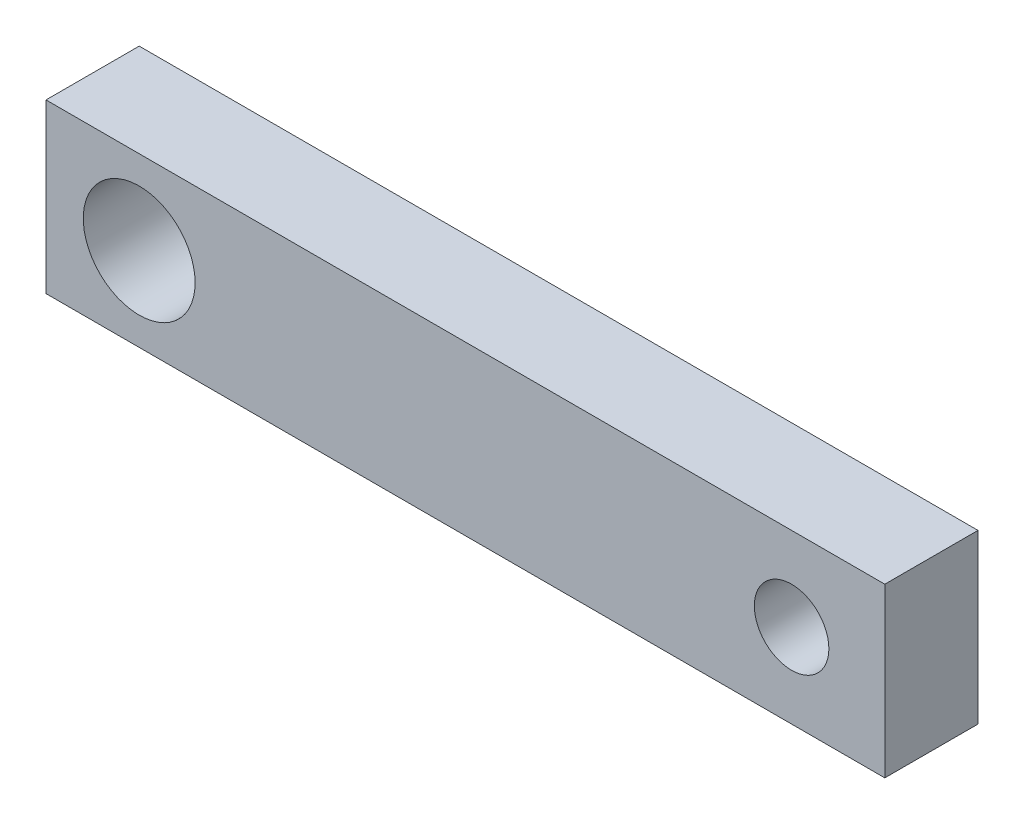
ISO-10303-21;
HEADER;
FILE_DESCRIPTION(('STEP AP214'),'2;1');
FILE_NAME('part.step','',(''),(''),'','','');
FILE_SCHEMA(('AUTOMOTIVE_DESIGN { 1 0 10303 214 1 1 1 1 }'));
ENDSEC;
DATA;
#1=APPLICATION_CONTEXT('core data for automotive mechanical design processes');
#2=APPLICATION_PROTOCOL_DEFINITION('international standard','automotive_design',2000,#1);
#3=PRODUCT_CONTEXT('',#1,'mechanical');
#4=PRODUCT('Part','Part','',(#3));
#5=PRODUCT_RELATED_PRODUCT_CATEGORY('part','',(#4));
#6=PRODUCT_DEFINITION_FORMATION('','',#4);
#7=PRODUCT_DEFINITION_CONTEXT('part definition',#1,'design');
#8=PRODUCT_DEFINITION('design','',#6,#7);
#9=PRODUCT_DEFINITION_SHAPE('','',#8);
#10=(LENGTH_UNIT() NAMED_UNIT(*) SI_UNIT(.MILLI.,.METRE.));
#11=(NAMED_UNIT(*) PLANE_ANGLE_UNIT() SI_UNIT($,.RADIAN.));
#12=(NAMED_UNIT(*) SI_UNIT($,.STERADIAN.) SOLID_ANGLE_UNIT());
#13=UNCERTAINTY_MEASURE_WITH_UNIT(LENGTH_MEASURE(1.E-05),#10,'distance_accuracy_value','');
#14=(GEOMETRIC_REPRESENTATION_CONTEXT(3) GLOBAL_UNCERTAINTY_ASSIGNED_CONTEXT((#13)) GLOBAL_UNIT_ASSIGNED_CONTEXT((#10,
#11,#12)) REPRESENTATION_CONTEXT('',''));
#15=CARTESIAN_POINT('',(0.,0.,0.));
#16=DIRECTION('',(0.,0.,1.));
#17=DIRECTION('',(1.,0.,0.));
#18=AXIS2_PLACEMENT_3D('',#15,#16,#17);
#19=CARTESIAN_POINT('',(0.,0.,20.));
#20=DIRECTION('',(0.,0.,-1.));
#21=DIRECTION('',(-1.,0.,0.));
#22=AXIS2_PLACEMENT_3D('',#19,#20,#21);
#23=PLANE('',#22);
#24=DIRECTION('',(0.,-1.,0.));
#25=VECTOR('',#24,1.);
#26=CARTESIAN_POINT('',(-20.,-18.,20.));
#27=LINE('',#26,#25);
#28=CARTESIAN_POINT('',(-20.,18.,20.));
#29=VERTEX_POINT('',#28);
#30=CARTESIAN_POINT('',(-20.,-18.,20.));
#31=VERTEX_POINT('',#30);
#32=EDGE_CURVE('E91',#29,#31,#27,.T.);
#33=ORIENTED_EDGE('',*,*,#32,.T.);
#34=DIRECTION('',(1.,0.,0.));
#35=VECTOR('',#34,1.);
#36=CARTESIAN_POINT('',(-20.,-18.,20.));
#37=LINE('',#36,#35);
#38=CARTESIAN_POINT('',(160.,-18.,20.));
#39=VERTEX_POINT('',#38);
#40=EDGE_CURVE('E86',#31,#39,#37,.T.);
#41=ORIENTED_EDGE('',*,*,#40,.T.);
#42=DIRECTION('',(0.,1.,0.));
#43=VECTOR('',#42,1.);
#44=CARTESIAN_POINT('',(160.,-18.,20.));
#45=LINE('',#44,#43);
#46=CARTESIAN_POINT('',(160.,18.,20.));
#47=VERTEX_POINT('',#46);
#48=EDGE_CURVE('E87',#39,#47,#45,.T.);
#49=ORIENTED_EDGE('',*,*,#48,.T.);
#50=DIRECTION('',(-1.,0.,0.));
#51=VECTOR('',#50,1.);
#52=CARTESIAN_POINT('',(-20.,18.,20.));
#53=LINE('',#52,#51);
#54=EDGE_CURVE('E57',#47,#29,#53,.T.);
#55=ORIENTED_EDGE('',*,*,#54,.T.);
#56=EDGE_LOOP('',(#33,#41,#49,#55));
#57=FACE_BOUND('',#56,.T.);
#58=CARTESIAN_POINT('',(0.,0.,20.));
#59=DIRECTION('',(0.,0.,1.));
#60=DIRECTION('',(1.,0.,0.));
#61=AXIS2_PLACEMENT_3D('',#58,#59,#60);
#62=CIRCLE('',#61,12.);
#63=CARTESIAN_POINT('',(12.,0.,20.));
#64=VERTEX_POINT('',#63);
#65=EDGE_CURVE('E106',#64,#64,#62,.T.);
#66=ORIENTED_EDGE('',*,*,#65,.F.);
#67=EDGE_LOOP('',(#66));
#68=FACE_BOUND('',#67,.T.);
#69=CARTESIAN_POINT('',(140.,0.,20.));
#70=DIRECTION('',(0.,0.,1.));
#71=DIRECTION('',(1.,0.,0.));
#72=AXIS2_PLACEMENT_3D('',#69,#70,#71);
#73=CIRCLE('',#72,8.00000000000001);
#74=CARTESIAN_POINT('',(148.,0.,20.));
#75=VERTEX_POINT('',#74);
#76=EDGE_CURVE('E123',#75,#75,#73,.T.);
#77=ORIENTED_EDGE('',*,*,#76,.F.);
#78=EDGE_LOOP('',(#77));
#79=FACE_BOUND('',#78,.T.);
#80=ADVANCED_FACE('F39',(#57,#68,#79),#23,.F.);
#81=CARTESIAN_POINT('',(0.,0.,0.));
#82=DIRECTION('',(0.,0.,-1.));
#83=DIRECTION('',(-1.,0.,0.));
#84=AXIS2_PLACEMENT_3D('',#81,#82,#83);
#85=PLANE('',#84);
#86=CARTESIAN_POINT('',(0.,0.,0.));
#87=DIRECTION('',(0.,0.,1.));
#88=DIRECTION('',(1.,0.,0.));
#89=AXIS2_PLACEMENT_3D('',#86,#87,#88);
#90=CIRCLE('',#89,12.);
#91=CARTESIAN_POINT('',(12.,0.,0.));
#92=VERTEX_POINT('',#91);
#93=EDGE_CURVE('E119',#92,#92,#90,.T.);
#94=ORIENTED_EDGE('',*,*,#93,.T.);
#95=EDGE_LOOP('',(#94));
#96=FACE_BOUND('',#95,.T.);
#97=DIRECTION('',(0.,-1.,0.));
#98=VECTOR('',#97,1.);
#99=CARTESIAN_POINT('',(-20.,-18.,0.));
#100=LINE('',#99,#98);
#101=CARTESIAN_POINT('',(-20.,18.,0.));
#102=VERTEX_POINT('',#101);
#103=CARTESIAN_POINT('',(-20.,-18.,0.));
#104=VERTEX_POINT('',#103);
#105=EDGE_CURVE('E104',#102,#104,#100,.T.);
#106=ORIENTED_EDGE('',*,*,#105,.F.);
#107=DIRECTION('',(-1.,0.,0.));
#108=VECTOR('',#107,1.);
#109=CARTESIAN_POINT('',(-20.,18.,0.));
#110=LINE('',#109,#108);
#111=CARTESIAN_POINT('',(160.,18.,0.));
#112=VERTEX_POINT('',#111);
#113=EDGE_CURVE('E80',#112,#102,#110,.T.);
#114=ORIENTED_EDGE('',*,*,#113,.F.);
#115=DIRECTION('',(0.,1.,0.));
#116=VECTOR('',#115,1.);
#117=CARTESIAN_POINT('',(160.,-18.,0.));
#118=LINE('',#117,#116);
#119=CARTESIAN_POINT('',(160.,-18.,0.));
#120=VERTEX_POINT('',#119);
#121=EDGE_CURVE('E74',#120,#112,#118,.T.);
#122=ORIENTED_EDGE('',*,*,#121,.F.);
#123=DIRECTION('',(1.,0.,0.));
#124=VECTOR('',#123,1.);
#125=CARTESIAN_POINT('',(-20.,-18.,0.));
#126=LINE('',#125,#124);
#127=EDGE_CURVE('E94',#104,#120,#126,.T.);
#128=ORIENTED_EDGE('',*,*,#127,.F.);
#129=EDGE_LOOP('',(#106,#114,#122,#128));
#130=FACE_BOUND('',#129,.T.);
#131=CARTESIAN_POINT('',(140.,0.,0.));
#132=DIRECTION('',(0.,0.,1.));
#133=DIRECTION('',(1.,0.,0.));
#134=AXIS2_PLACEMENT_3D('',#131,#132,#133);
#135=CIRCLE('',#134,8.00000000000001);
#136=CARTESIAN_POINT('',(148.,0.,0.));
#137=VERTEX_POINT('',#136);
#138=EDGE_CURVE('E125',#137,#137,#135,.T.);
#139=ORIENTED_EDGE('',*,*,#138,.T.);
#140=EDGE_LOOP('',(#139));
#141=FACE_BOUND('',#140,.T.);
#142=ADVANCED_FACE('F114',(#96,#130,#141),#85,.T.);
#143=CARTESIAN_POINT('',(-20.,-18.,20.));
#144=DIRECTION('',(1.,0.,0.));
#145=DIRECTION('',(0.,0.,-1.));
#146=AXIS2_PLACEMENT_3D('',#143,#144,#145);
#147=PLANE('',#146);
#148=ORIENTED_EDGE('',*,*,#105,.T.);
#149=DIRECTION('',(0.,0.,-1.));
#150=VECTOR('',#149,1.);
#151=CARTESIAN_POINT('',(-20.,-18.,20.));
#152=LINE('',#151,#150);
#153=EDGE_CURVE('E11',#31,#104,#152,.T.);
#154=ORIENTED_EDGE('',*,*,#153,.F.);
#155=ORIENTED_EDGE('',*,*,#32,.F.);
#156=DIRECTION('',(0.,0.,-1.));
#157=VECTOR('',#156,1.);
#158=CARTESIAN_POINT('',(-20.,18.,20.));
#159=LINE('',#158,#157);
#160=EDGE_CURVE('E98',#29,#102,#159,.T.);
#161=ORIENTED_EDGE('',*,*,#160,.T.);
#162=EDGE_LOOP('',(#148,#154,#155,#161));
#163=FACE_BOUND('',#162,.T.);
#164=ADVANCED_FACE('F41',(#163),#147,.F.);
#165=CARTESIAN_POINT('',(-20.,-18.,20.));
#166=DIRECTION('',(0.,1.,0.));
#167=DIRECTION('',(0.,0.,1.));
#168=AXIS2_PLACEMENT_3D('',#165,#166,#167);
#169=PLANE('',#168);
#170=ORIENTED_EDGE('',*,*,#127,.T.);
#171=DIRECTION('',(0.,0.,-1.));
#172=VECTOR('',#171,1.);
#173=CARTESIAN_POINT('',(160.,-18.,20.));
#174=LINE('',#173,#172);
#175=EDGE_CURVE('E48',#39,#120,#174,.T.);
#176=ORIENTED_EDGE('',*,*,#175,.F.);
#177=ORIENTED_EDGE('',*,*,#40,.F.);
#178=ORIENTED_EDGE('',*,*,#153,.T.);
#179=EDGE_LOOP('',(#170,#176,#177,#178));
#180=FACE_BOUND('',#179,.T.);
#181=ADVANCED_FACE('F92',(#180),#169,.F.);
#182=CARTESIAN_POINT('',(160.,-18.,20.));
#183=DIRECTION('',(-1.,0.,0.));
#184=DIRECTION('',(0.,0.,1.));
#185=AXIS2_PLACEMENT_3D('',#182,#183,#184);
#186=PLANE('',#185);
#187=ORIENTED_EDGE('',*,*,#121,.T.);
#188=DIRECTION('',(0.,0.,-1.));
#189=VECTOR('',#188,1.);
#190=CARTESIAN_POINT('',(160.,18.,20.));
#191=LINE('',#190,#189);
#192=EDGE_CURVE('E96',#47,#112,#191,.T.);
#193=ORIENTED_EDGE('',*,*,#192,.F.);
#194=ORIENTED_EDGE('',*,*,#48,.F.);
#195=ORIENTED_EDGE('',*,*,#175,.T.);
#196=EDGE_LOOP('',(#187,#193,#194,#195));
#197=FACE_BOUND('',#196,.T.);
#198=ADVANCED_FACE('F100',(#197),#186,.F.);
#199=CARTESIAN_POINT('',(-20.,18.,20.));
#200=DIRECTION('',(0.,-1.,0.));
#201=DIRECTION('',(0.,0.,-1.));
#202=AXIS2_PLACEMENT_3D('',#199,#200,#201);
#203=PLANE('',#202);
#204=ORIENTED_EDGE('',*,*,#113,.T.);
#205=ORIENTED_EDGE('',*,*,#160,.F.);
#206=ORIENTED_EDGE('',*,*,#54,.F.);
#207=ORIENTED_EDGE('',*,*,#192,.T.);
#208=EDGE_LOOP('',(#204,#205,#206,#207));
#209=FACE_BOUND('',#208,.T.);
#210=ADVANCED_FACE('F112',(#209),#203,.F.);
#211=CARTESIAN_POINT('',(0.,0.,20.));
#212=DIRECTION('',(0.,0.,-1.));
#213=DIRECTION('',(-1.,0.,0.));
#214=AXIS2_PLACEMENT_3D('',#211,#212,#213);
#215=CYLINDRICAL_SURFACE('',#214,12.);
#216=ORIENTED_EDGE('',*,*,#65,.T.);
#217=EDGE_LOOP('',(#216));
#218=FACE_BOUND('',#217,.T.);
#219=ORIENTED_EDGE('',*,*,#93,.F.);
#220=EDGE_LOOP('',(#219));
#221=FACE_BOUND('',#220,.T.);
#222=ADVANCED_FACE('F141',(#218,#221),#215,.F.);
#223=CARTESIAN_POINT('',(140.,0.,20.));
#224=DIRECTION('',(0.,0.,-1.));
#225=DIRECTION('',(-1.,0.,0.));
#226=AXIS2_PLACEMENT_3D('',#223,#224,#225);
#227=CYLINDRICAL_SURFACE('',#226,8.00000000000001);
#228=ORIENTED_EDGE('',*,*,#76,.T.);
#229=EDGE_LOOP('',(#228));
#230=FACE_BOUND('',#229,.T.);
#231=ORIENTED_EDGE('',*,*,#138,.F.);
#232=EDGE_LOOP('',(#231));
#233=FACE_BOUND('',#232,.T.);
#234=ADVANCED_FACE('F127',(#230,#233),#227,.F.);
#235=CLOSED_SHELL('',(#80,#142,#164,#181,#198,#210,#222,#234));
#236=MANIFOLD_SOLID_BREP('B2',#235);
#237=ADVANCED_BREP_SHAPE_REPRESENTATION('',(#18,#236),#14);
#238=SHAPE_DEFINITION_REPRESENTATION(#9,#237);
ENDSEC;
END-ISO-10303-21;
